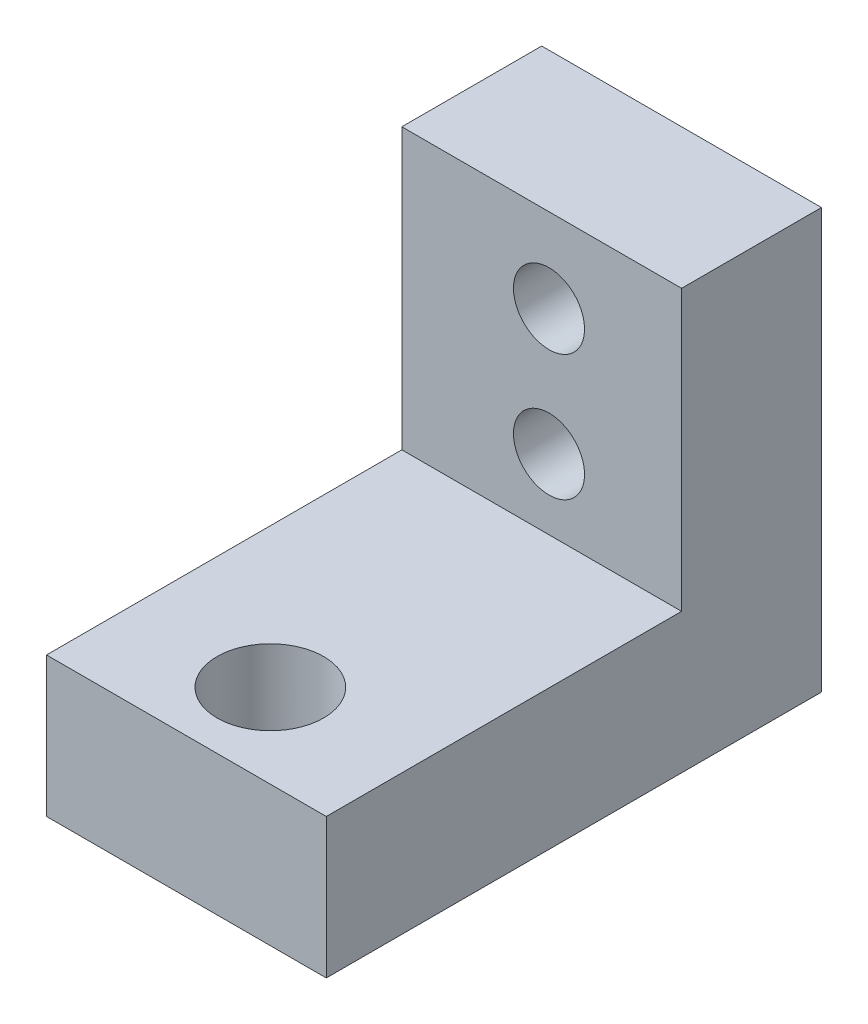
ISO-10303-21;
HEADER;
FILE_DESCRIPTION(('STEP AP214'),'2;1');
FILE_NAME('part.step','',(''),(''),'','','');
FILE_SCHEMA(('AUTOMOTIVE_DESIGN { 1 0 10303 214 1 1 1 1 }'));
ENDSEC;
DATA;
#1=APPLICATION_CONTEXT('core data for automotive mechanical design processes');
#2=APPLICATION_PROTOCOL_DEFINITION('international standard','automotive_design',2000,#1);
#3=PRODUCT_CONTEXT('',#1,'mechanical');
#4=PRODUCT('Part','Part','',(#3));
#5=PRODUCT_RELATED_PRODUCT_CATEGORY('part','',(#4));
#6=PRODUCT_DEFINITION_FORMATION('','',#4);
#7=PRODUCT_DEFINITION_CONTEXT('part definition',#1,'design');
#8=PRODUCT_DEFINITION('design','',#6,#7);
#9=PRODUCT_DEFINITION_SHAPE('','',#8);
#10=(LENGTH_UNIT() NAMED_UNIT(*) SI_UNIT(.MILLI.,.METRE.));
#11=(NAMED_UNIT(*) PLANE_ANGLE_UNIT() SI_UNIT($,.RADIAN.));
#12=(NAMED_UNIT(*) SI_UNIT($,.STERADIAN.) SOLID_ANGLE_UNIT());
#13=UNCERTAINTY_MEASURE_WITH_UNIT(LENGTH_MEASURE(1.E-05),#10,'distance_accuracy_value','');
#14=(GEOMETRIC_REPRESENTATION_CONTEXT(3) GLOBAL_UNCERTAINTY_ASSIGNED_CONTEXT((#13)) GLOBAL_UNIT_ASSIGNED_CONTEXT((#10,
#11,#12)) REPRESENTATION_CONTEXT('',''));
#15=CARTESIAN_POINT('',(0.,0.,0.));
#16=DIRECTION('',(0.,0.,1.));
#17=DIRECTION('',(1.,0.,0.));
#18=AXIS2_PLACEMENT_3D('',#15,#16,#17);
#19=CARTESIAN_POINT('',(0.,10.,0.));
#20=DIRECTION('',(1.,0.,0.));
#21=DIRECTION('',(0.,0.,-1.));
#22=AXIS2_PLACEMENT_3D('',#19,#20,#21);
#23=PLANE('',#22);
#24=DIRECTION('',(0.,0.,1.));
#25=VECTOR('',#24,1.);
#26=CARTESIAN_POINT('',(0.,0.,0.));
#27=LINE('',#26,#25);
#28=CARTESIAN_POINT('',(0.,0.,-35.4));
#29=VERTEX_POINT('',#28);
#30=CARTESIAN_POINT('',(0.,0.,0.));
#31=VERTEX_POINT('',#30);
#32=EDGE_CURVE('E101',#29,#31,#27,.T.);
#33=ORIENTED_EDGE('',*,*,#32,.T.);
#34=DIRECTION('',(0.,-1.,0.));
#35=VECTOR('',#34,1.);
#36=CARTESIAN_POINT('',(0.,10.,0.));
#37=LINE('',#36,#35);
#38=CARTESIAN_POINT('',(0.,10.,0.));
#39=VERTEX_POINT('',#38);
#40=EDGE_CURVE('E11',#39,#31,#37,.T.);
#41=ORIENTED_EDGE('',*,*,#40,.F.);
#42=DIRECTION('',(0.,0.,1.));
#43=VECTOR('',#42,1.);
#44=CARTESIAN_POINT('',(0.,10.,0.));
#45=LINE('',#44,#43);
#46=CARTESIAN_POINT('',(0.,10.,-25.4));
#47=VERTEX_POINT('',#46);
#48=EDGE_CURVE('E93',#47,#39,#45,.T.);
#49=ORIENTED_EDGE('',*,*,#48,.F.);
#50=DIRECTION('',(0.,-1.,0.));
#51=VECTOR('',#50,1.);
#52=CARTESIAN_POINT('',(0.,30.,-25.4));
#53=LINE('',#52,#51);
#54=CARTESIAN_POINT('',(0.,30.,-25.4));
#55=VERTEX_POINT('',#54);
#56=EDGE_CURVE('E55',#55,#47,#53,.T.);
#57=ORIENTED_EDGE('',*,*,#56,.F.);
#58=DIRECTION('',(0.,0.,1.));
#59=VECTOR('',#58,1.);
#60=CARTESIAN_POINT('',(0.,30.,-25.4));
#61=LINE('',#60,#59);
#62=CARTESIAN_POINT('',(0.,30.,-35.4));
#63=VERTEX_POINT('',#62);
#64=EDGE_CURVE('E126',#63,#55,#61,.T.);
#65=ORIENTED_EDGE('',*,*,#64,.F.);
#66=DIRECTION('',(0.,-1.,0.));
#67=VECTOR('',#66,1.);
#68=CARTESIAN_POINT('',(0.,30.,-35.4));
#69=LINE('',#68,#67);
#70=EDGE_CURVE('E104',#63,#29,#69,.T.);
#71=ORIENTED_EDGE('',*,*,#70,.T.);
#72=EDGE_LOOP('',(#33,#41,#49,#57,#65,#71));
#73=FACE_BOUND('',#72,.T.);
#74=ADVANCED_FACE('F38',(#73),#23,.F.);
#75=CARTESIAN_POINT('',(0.,10.,0.));
#76=DIRECTION('',(0.,0.,-1.));
#77=DIRECTION('',(-1.,0.,0.));
#78=AXIS2_PLACEMENT_3D('',#75,#76,#77);
#79=PLANE('',#78);
#80=DIRECTION('',(1.,0.,0.));
#81=VECTOR('',#80,1.);
#82=CARTESIAN_POINT('',(0.,0.,0.));
#83=LINE('',#82,#81);
#84=CARTESIAN_POINT('',(20.,0.,0.));
#85=VERTEX_POINT('',#84);
#86=EDGE_CURVE('E68',#31,#85,#83,.T.);
#87=ORIENTED_EDGE('',*,*,#86,.T.);
#88=DIRECTION('',(0.,-1.,0.));
#89=VECTOR('',#88,1.);
#90=CARTESIAN_POINT('',(20.,10.,0.));
#91=LINE('',#90,#89);
#92=CARTESIAN_POINT('',(20.,10.,0.));
#93=VERTEX_POINT('',#92);
#94=EDGE_CURVE('E47',#93,#85,#91,.T.);
#95=ORIENTED_EDGE('',*,*,#94,.F.);
#96=DIRECTION('',(1.,0.,0.));
#97=VECTOR('',#96,1.);
#98=CARTESIAN_POINT('',(0.,10.,0.));
#99=LINE('',#98,#97);
#100=EDGE_CURVE('E83',#39,#93,#99,.T.);
#101=ORIENTED_EDGE('',*,*,#100,.F.);
#102=ORIENTED_EDGE('',*,*,#40,.T.);
#103=EDGE_LOOP('',(#87,#95,#101,#102));
#104=FACE_BOUND('',#103,.T.);
#105=ADVANCED_FACE('F85',(#104),#79,.F.);
#106=CARTESIAN_POINT('',(20.,10.,0.));
#107=DIRECTION('',(-1.,0.,0.));
#108=DIRECTION('',(0.,0.,1.));
#109=AXIS2_PLACEMENT_3D('',#106,#107,#108);
#110=PLANE('',#109);
#111=DIRECTION('',(0.,0.,-1.));
#112=VECTOR('',#111,1.);
#113=CARTESIAN_POINT('',(20.,0.,0.));
#114=LINE('',#113,#112);
#115=CARTESIAN_POINT('',(20.,0.,-35.4));
#116=VERTEX_POINT('',#115);
#117=EDGE_CURVE('E98',#85,#116,#114,.T.);
#118=ORIENTED_EDGE('',*,*,#117,.T.);
#119=DIRECTION('',(0.,-1.,0.));
#120=VECTOR('',#119,1.);
#121=CARTESIAN_POINT('',(20.,30.,-35.4));
#122=LINE('',#121,#120);
#123=CARTESIAN_POINT('',(20.,30.,-35.4));
#124=VERTEX_POINT('',#123);
#125=EDGE_CURVE('E119',#124,#116,#122,.T.);
#126=ORIENTED_EDGE('',*,*,#125,.F.);
#127=DIRECTION('',(0.,0.,-1.));
#128=VECTOR('',#127,1.);
#129=CARTESIAN_POINT('',(20.,30.,-25.4));
#130=LINE('',#129,#128);
#131=CARTESIAN_POINT('',(20.,30.,-25.4));
#132=VERTEX_POINT('',#131);
#133=EDGE_CURVE('E128',#132,#124,#130,.T.);
#134=ORIENTED_EDGE('',*,*,#133,.F.);
#135=DIRECTION('',(0.,-1.,0.));
#136=VECTOR('',#135,1.);
#137=CARTESIAN_POINT('',(20.,30.,-25.4));
#138=LINE('',#137,#136);
#139=CARTESIAN_POINT('',(20.,10.,-25.4));
#140=VERTEX_POINT('',#139);
#141=EDGE_CURVE('E109',#132,#140,#138,.T.);
#142=ORIENTED_EDGE('',*,*,#141,.T.);
#143=DIRECTION('',(0.,0.,-1.));
#144=VECTOR('',#143,1.);
#145=CARTESIAN_POINT('',(20.,10.,0.));
#146=LINE('',#145,#144);
#147=EDGE_CURVE('E92',#93,#140,#146,.T.);
#148=ORIENTED_EDGE('',*,*,#147,.F.);
#149=ORIENTED_EDGE('',*,*,#94,.T.);
#150=EDGE_LOOP('',(#118,#126,#134,#142,#148,#149));
#151=FACE_BOUND('',#150,.T.);
#152=ADVANCED_FACE('F174',(#151),#110,.F.);
#153=CARTESIAN_POINT('',(0.,10.,0.));
#154=DIRECTION('',(0.,-1.,0.));
#155=DIRECTION('',(0.,0.,-1.));
#156=AXIS2_PLACEMENT_3D('',#153,#154,#155);
#157=PLANE('',#156);
#158=CARTESIAN_POINT('',(10.,10.,-6.));
#159=DIRECTION('',(0.,1.,0.));
#160=DIRECTION('',(0.,0.,1.));
#161=AXIS2_PLACEMENT_3D('',#158,#159,#160);
#162=CIRCLE('',#161,3.81);
#163=CARTESIAN_POINT('',(10.,10.,-2.19));
#164=VERTEX_POINT('',#163);
#165=EDGE_CURVE('E136',#164,#164,#162,.T.);
#166=ORIENTED_EDGE('',*,*,#165,.F.);
#167=EDGE_LOOP('',(#166));
#168=FACE_BOUND('',#167,.T.);
#169=ORIENTED_EDGE('',*,*,#48,.T.);
#170=ORIENTED_EDGE('',*,*,#100,.T.);
#171=ORIENTED_EDGE('',*,*,#147,.T.);
#172=DIRECTION('',(-1.,0.,0.));
#173=VECTOR('',#172,1.);
#174=CARTESIAN_POINT('',(0.,10.,-25.4));
#175=LINE('',#174,#173);
#176=EDGE_CURVE('E72',#140,#47,#175,.T.);
#177=ORIENTED_EDGE('',*,*,#176,.T.);
#178=EDGE_LOOP('',(#169,#170,#171,#177));
#179=FACE_BOUND('',#178,.T.);
#180=ADVANCED_FACE('F96',(#168,#179),#157,.F.);
#181=CARTESIAN_POINT('',(0.,0.,0.));
#182=DIRECTION('',(0.,-1.,0.));
#183=DIRECTION('',(0.,0.,-1.));
#184=AXIS2_PLACEMENT_3D('',#181,#182,#183);
#185=PLANE('',#184);
#186=CARTESIAN_POINT('',(10.,0.,-6.));
#187=DIRECTION('',(0.,-1.,0.));
#188=DIRECTION('',(0.,0.,-1.));
#189=AXIS2_PLACEMENT_3D('',#186,#187,#188);
#190=CIRCLE('',#189,3.81);
#191=CARTESIAN_POINT('',(10.,0.,-9.81));
#192=VERTEX_POINT('',#191);
#193=EDGE_CURVE('E41',#192,#192,#190,.T.);
#194=ORIENTED_EDGE('',*,*,#193,.F.);
#195=EDGE_LOOP('',(#194));
#196=FACE_BOUND('',#195,.T.);
#197=ORIENTED_EDGE('',*,*,#32,.F.);
#198=DIRECTION('',(-1.,0.,0.));
#199=VECTOR('',#198,1.);
#200=CARTESIAN_POINT('',(0.,0.,-35.4));
#201=LINE('',#200,#199);
#202=EDGE_CURVE('E124',#116,#29,#201,.T.);
#203=ORIENTED_EDGE('',*,*,#202,.F.);
#204=ORIENTED_EDGE('',*,*,#117,.F.);
#205=ORIENTED_EDGE('',*,*,#86,.F.);
#206=EDGE_LOOP('',(#197,#203,#204,#205));
#207=FACE_BOUND('',#206,.T.);
#208=ADVANCED_FACE('F167',(#196,#207),#185,.T.);
#209=CARTESIAN_POINT('',(0.,30.,-25.4));
#210=DIRECTION('',(0.,0.,-1.));
#211=DIRECTION('',(-1.,0.,0.));
#212=AXIS2_PLACEMENT_3D('',#209,#210,#211);
#213=PLANE('',#212);
#214=CARTESIAN_POINT('',(10.5220183015287,24.,-25.4));
#215=DIRECTION('',(0.,0.,-1.));
#216=DIRECTION('',(-1.,0.,0.));
#217=AXIS2_PLACEMENT_3D('',#214,#215,#216);
#218=CIRCLE('',#217,2.54);
#219=CARTESIAN_POINT('',(7.98201830152871,24.,-25.4));
#220=VERTEX_POINT('',#219);
#221=EDGE_CURVE('E139',#220,#220,#218,.T.);
#222=ORIENTED_EDGE('',*,*,#221,.T.);
#223=EDGE_LOOP('',(#222));
#224=FACE_BOUND('',#223,.T.);
#225=CARTESIAN_POINT('',(10.5220183015287,15.,-25.4));
#226=DIRECTION('',(0.,0.,-1.));
#227=DIRECTION('',(-1.,0.,0.));
#228=AXIS2_PLACEMENT_3D('',#225,#226,#227);
#229=CIRCLE('',#228,2.54);
#230=CARTESIAN_POINT('',(7.98201830152871,15.,-25.4));
#231=VERTEX_POINT('',#230);
#232=EDGE_CURVE('E142',#231,#231,#229,.T.);
#233=ORIENTED_EDGE('',*,*,#232,.T.);
#234=EDGE_LOOP('',(#233));
#235=FACE_BOUND('',#234,.T.);
#236=ORIENTED_EDGE('',*,*,#176,.F.);
#237=ORIENTED_EDGE('',*,*,#141,.F.);
#238=DIRECTION('',(1.,0.,0.));
#239=VECTOR('',#238,1.);
#240=CARTESIAN_POINT('',(0.,30.,-25.4));
#241=LINE('',#240,#239);
#242=EDGE_CURVE('E131',#55,#132,#241,.T.);
#243=ORIENTED_EDGE('',*,*,#242,.F.);
#244=ORIENTED_EDGE('',*,*,#56,.T.);
#245=EDGE_LOOP('',(#236,#237,#243,#244));
#246=FACE_BOUND('',#245,.T.);
#247=ADVANCED_FACE('F159',(#224,#235,#246),#213,.F.);
#248=CARTESIAN_POINT('',(0.,30.,-35.4));
#249=DIRECTION('',(0.,0.,1.));
#250=DIRECTION('',(1.,0.,0.));
#251=AXIS2_PLACEMENT_3D('',#248,#249,#250);
#252=PLANE('',#251);
#253=CARTESIAN_POINT('',(10.5220183015287,24.,-35.4));
#254=DIRECTION('',(0.,0.,-1.));
#255=DIRECTION('',(-1.,0.,0.));
#256=AXIS2_PLACEMENT_3D('',#253,#254,#255);
#257=CIRCLE('',#256,2.54);
#258=CARTESIAN_POINT('',(7.98201830152871,24.,-35.4));
#259=VERTEX_POINT('',#258);
#260=EDGE_CURVE('E145',#259,#259,#257,.T.);
#261=ORIENTED_EDGE('',*,*,#260,.F.);
#262=EDGE_LOOP('',(#261));
#263=FACE_BOUND('',#262,.T.);
#264=CARTESIAN_POINT('',(10.5220183015287,15.,-35.4));
#265=DIRECTION('',(0.,0.,-1.));
#266=DIRECTION('',(-1.,0.,0.));
#267=AXIS2_PLACEMENT_3D('',#264,#265,#266);
#268=CIRCLE('',#267,2.54);
#269=CARTESIAN_POINT('',(7.98201830152871,15.,-35.4));
#270=VERTEX_POINT('',#269);
#271=EDGE_CURVE('E146',#270,#270,#268,.T.);
#272=ORIENTED_EDGE('',*,*,#271,.F.);
#273=EDGE_LOOP('',(#272));
#274=FACE_BOUND('',#273,.T.);
#275=ORIENTED_EDGE('',*,*,#202,.T.);
#276=ORIENTED_EDGE('',*,*,#70,.F.);
#277=DIRECTION('',(-1.,0.,0.));
#278=VECTOR('',#277,1.);
#279=CARTESIAN_POINT('',(0.,30.,-35.4));
#280=LINE('',#279,#278);
#281=EDGE_CURVE('E123',#124,#63,#280,.T.);
#282=ORIENTED_EDGE('',*,*,#281,.F.);
#283=ORIENTED_EDGE('',*,*,#125,.T.);
#284=EDGE_LOOP('',(#275,#276,#282,#283));
#285=FACE_BOUND('',#284,.T.);
#286=ADVANCED_FACE('F155',(#263,#274,#285),#252,.F.);
#287=CARTESIAN_POINT('',(0.,30.,0.));
#288=DIRECTION('',(0.,-1.,0.));
#289=DIRECTION('',(0.,0.,-1.));
#290=AXIS2_PLACEMENT_3D('',#287,#288,#289);
#291=PLANE('',#290);
#292=ORIENTED_EDGE('',*,*,#64,.T.);
#293=ORIENTED_EDGE('',*,*,#242,.T.);
#294=ORIENTED_EDGE('',*,*,#133,.T.);
#295=ORIENTED_EDGE('',*,*,#281,.T.);
#296=EDGE_LOOP('',(#292,#293,#294,#295));
#297=FACE_BOUND('',#296,.T.);
#298=ADVANCED_FACE('F158',(#297),#291,.F.);
#299=CARTESIAN_POINT('',(10.,-20.,-6.));
#300=DIRECTION('',(0.,1.,0.));
#301=DIRECTION('',(0.,0.,1.));
#302=AXIS2_PLACEMENT_3D('',#299,#300,#301);
#303=CYLINDRICAL_SURFACE('',#302,3.81);
#304=ORIENTED_EDGE('',*,*,#193,.T.);
#305=EDGE_LOOP('',(#304));
#306=FACE_BOUND('',#305,.T.);
#307=ORIENTED_EDGE('',*,*,#165,.T.);
#308=EDGE_LOOP('',(#307));
#309=FACE_BOUND('',#308,.T.);
#310=ADVANCED_FACE('F242',(#306,#309),#303,.F.);
#311=CARTESIAN_POINT('',(10.5220183015287,15.,-5.4));
#312=DIRECTION('',(0.,0.,-1.));
#313=DIRECTION('',(-1.,0.,0.));
#314=AXIS2_PLACEMENT_3D('',#311,#312,#313);
#315=CYLINDRICAL_SURFACE('',#314,2.54);
#316=ORIENTED_EDGE('',*,*,#271,.T.);
#317=EDGE_LOOP('',(#316));
#318=FACE_BOUND('',#317,.T.);
#319=ORIENTED_EDGE('',*,*,#232,.F.);
#320=EDGE_LOOP('',(#319));
#321=FACE_BOUND('',#320,.T.);
#322=ADVANCED_FACE('F249',(#318,#321),#315,.F.);
#323=CARTESIAN_POINT('',(10.5220183015287,24.,-5.4));
#324=DIRECTION('',(0.,0.,-1.));
#325=DIRECTION('',(-1.,0.,0.));
#326=AXIS2_PLACEMENT_3D('',#323,#324,#325);
#327=CYLINDRICAL_SURFACE('',#326,2.54);
#328=ORIENTED_EDGE('',*,*,#260,.T.);
#329=EDGE_LOOP('',(#328));
#330=FACE_BOUND('',#329,.T.);
#331=ORIENTED_EDGE('',*,*,#221,.F.);
#332=EDGE_LOOP('',(#331));
#333=FACE_BOUND('',#332,.T.);
#334=ADVANCED_FACE('F152',(#330,#333),#327,.F.);
#335=CLOSED_SHELL('',(#74,#105,#152,#180,#208,#247,#286,#298,#310,#322,#334));
#336=MANIFOLD_SOLID_BREP('B2',#335);
#337=ADVANCED_BREP_SHAPE_REPRESENTATION('',(#18,#336),#14);
#338=SHAPE_DEFINITION_REPRESENTATION(#9,#337);
ENDSEC;
END-ISO-10303-21;
